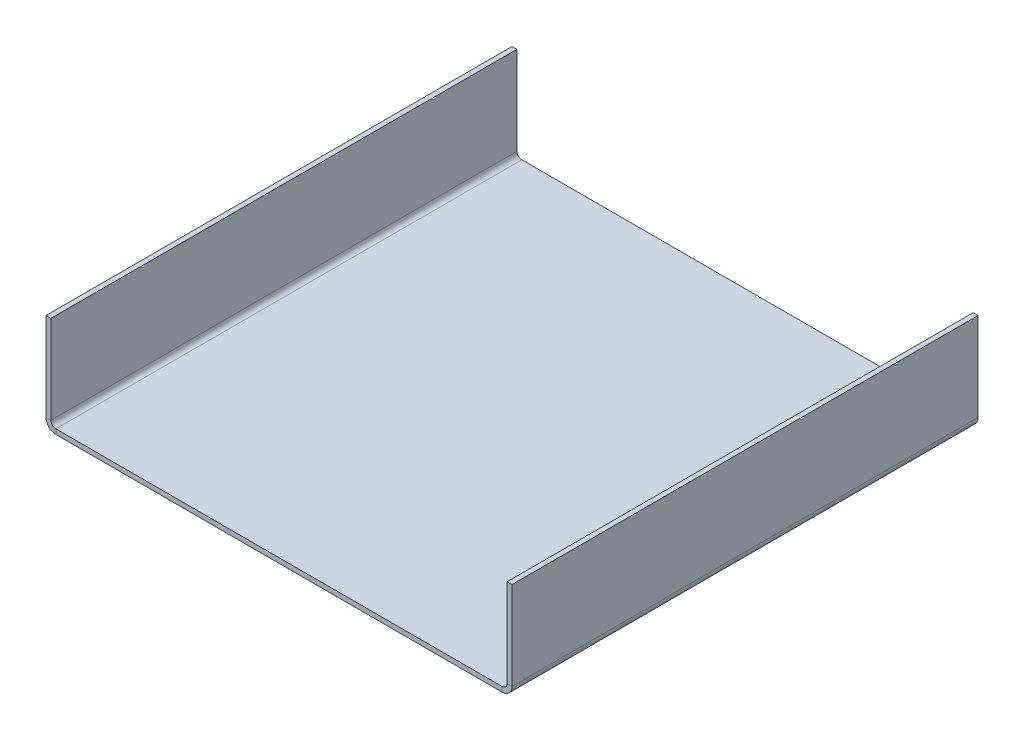
ISO-10303-21;
HEADER;
FILE_DESCRIPTION(('STEP AP214'),'2;1');
FILE_NAME('part.step','',(''),(''),'','','');
FILE_SCHEMA(('AUTOMOTIVE_DESIGN { 1 0 10303 214 1 1 1 1 }'));
ENDSEC;
DATA;
#1=APPLICATION_CONTEXT('core data for automotive mechanical design processes');
#2=APPLICATION_PROTOCOL_DEFINITION('international standard','automotive_design',2000,#1);
#3=PRODUCT_CONTEXT('',#1,'mechanical');
#4=PRODUCT('Part','Part','',(#3));
#5=PRODUCT_RELATED_PRODUCT_CATEGORY('part','',(#4));
#6=PRODUCT_DEFINITION_FORMATION('','',#4);
#7=PRODUCT_DEFINITION_CONTEXT('part definition',#1,'design');
#8=PRODUCT_DEFINITION('design','',#6,#7);
#9=PRODUCT_DEFINITION_SHAPE('','',#8);
#10=(LENGTH_UNIT() NAMED_UNIT(*) SI_UNIT(.MILLI.,.METRE.));
#11=(NAMED_UNIT(*) PLANE_ANGLE_UNIT() SI_UNIT($,.RADIAN.));
#12=(NAMED_UNIT(*) SI_UNIT($,.STERADIAN.) SOLID_ANGLE_UNIT());
#13=UNCERTAINTY_MEASURE_WITH_UNIT(LENGTH_MEASURE(1.E-05),#10,'distance_accuracy_value','');
#14=(GEOMETRIC_REPRESENTATION_CONTEXT(3) GLOBAL_UNCERTAINTY_ASSIGNED_CONTEXT((#13)) GLOBAL_UNIT_ASSIGNED_CONTEXT((#10,
#11,#12)) REPRESENTATION_CONTEXT('',''));
#15=CARTESIAN_POINT('',(0.,0.,0.));
#16=DIRECTION('',(0.,0.,1.));
#17=DIRECTION('',(1.,0.,0.));
#18=AXIS2_PLACEMENT_3D('',#15,#16,#17);
#19=CARTESIAN_POINT('',(0.,0.,0.));
#20=DIRECTION('',(0.,-1.,0.));
#21=DIRECTION('',(0.,0.,-1.));
#22=AXIS2_PLACEMENT_3D('',#19,#20,#21);
#23=PLANE('',#22);
#24=DIRECTION('',(-1.,0.,0.));
#25=VECTOR('',#24,1.);
#26=CARTESIAN_POINT('',(-47.5,0.,-47.5));
#27=LINE('',#26,#25);
#28=CARTESIAN_POINT('',(45.5,0.,-47.5));
#29=VERTEX_POINT('',#28);
#30=CARTESIAN_POINT('',(-45.5,0.,-47.5));
#31=VERTEX_POINT('',#30);
#32=EDGE_CURVE('E13',#29,#31,#27,.T.);
#33=ORIENTED_EDGE('',*,*,#32,.F.);
#34=DIRECTION('',(0.,0.,-1.));
#35=VECTOR('',#34,1.);
#36=CARTESIAN_POINT('',(45.5,0.,-47.5));
#37=LINE('',#36,#35);
#38=CARTESIAN_POINT('',(45.5,0.,47.5));
#39=VERTEX_POINT('',#38);
#40=EDGE_CURVE('E218',#29,#39,#37,.F.);
#41=ORIENTED_EDGE('',*,*,#40,.T.);
#42=DIRECTION('',(1.,0.,0.));
#43=VECTOR('',#42,1.);
#44=CARTESIAN_POINT('',(-47.5,0.,47.5));
#45=LINE('',#44,#43);
#46=CARTESIAN_POINT('',(-45.5,0.,47.5));
#47=VERTEX_POINT('',#46);
#48=EDGE_CURVE('E92',#47,#39,#45,.T.);
#49=ORIENTED_EDGE('',*,*,#48,.F.);
#50=DIRECTION('',(0.,0.,1.));
#51=VECTOR('',#50,1.);
#52=CARTESIAN_POINT('',(-45.5,0.,47.5));
#53=LINE('',#52,#51);
#54=EDGE_CURVE('E270',#47,#31,#53,.F.);
#55=ORIENTED_EDGE('',*,*,#54,.T.);
#56=EDGE_LOOP('',(#33,#41,#49,#55));
#57=FACE_BOUND('',#56,.T.);
#58=ADVANCED_FACE('F83',(#57),#23,.T.);
#59=CARTESIAN_POINT('',(0.,1.,0.));
#60=DIRECTION('',(0.,-1.,0.));
#61=DIRECTION('',(0.,0.,-1.));
#62=AXIS2_PLACEMENT_3D('',#59,#60,#61);
#63=PLANE('',#62);
#64=DIRECTION('',(0.,0.,-1.));
#65=VECTOR('',#64,1.);
#66=CARTESIAN_POINT('',(45.5,0.999999999999997,-47.5));
#67=LINE('',#66,#65);
#68=CARTESIAN_POINT('',(45.5,0.999999999999997,-47.5));
#69=VERTEX_POINT('',#68);
#70=CARTESIAN_POINT('',(45.5,0.999999999999997,47.5));
#71=VERTEX_POINT('',#70);
#72=EDGE_CURVE('E229',#69,#71,#67,.F.);
#73=ORIENTED_EDGE('',*,*,#72,.F.);
#74=DIRECTION('',(1.,0.,0.));
#75=VECTOR('',#74,1.);
#76=CARTESIAN_POINT('',(0.,1.,-47.5));
#77=LINE('',#76,#75);
#78=CARTESIAN_POINT('',(-45.5,0.999999999999997,-47.5));
#79=VERTEX_POINT('',#78);
#80=EDGE_CURVE('E290',#69,#79,#77,.F.);
#81=ORIENTED_EDGE('',*,*,#80,.T.);
#82=DIRECTION('',(0.,0.,1.));
#83=VECTOR('',#82,1.);
#84=CARTESIAN_POINT('',(-45.5,0.999999999999997,47.5));
#85=LINE('',#84,#83);
#86=CARTESIAN_POINT('',(-45.5,0.999999999999997,47.5));
#87=VERTEX_POINT('',#86);
#88=EDGE_CURVE('E281',#87,#79,#85,.F.);
#89=ORIENTED_EDGE('',*,*,#88,.F.);
#90=DIRECTION('',(1.,0.,0.));
#91=VECTOR('',#90,1.);
#92=CARTESIAN_POINT('',(0.,1.,47.5));
#93=LINE('',#92,#91);
#94=EDGE_CURVE('E87',#87,#71,#93,.T.);
#95=ORIENTED_EDGE('',*,*,#94,.T.);
#96=EDGE_LOOP('',(#73,#81,#89,#95));
#97=FACE_BOUND('',#96,.T.);
#98=ADVANCED_FACE('F299',(#97),#63,.F.);
#99=CARTESIAN_POINT('',(-47.5,0.,-47.5));
#100=DIRECTION('',(0.,0.,1.));
#101=DIRECTION('',(-1.,0.,0.));
#102=AXIS2_PLACEMENT_3D('',#99,#100,#101);
#103=PLANE('',#102);
#104=ORIENTED_EDGE('',*,*,#80,.F.);
#105=DIRECTION('',(0.,-1.,0.));
#106=VECTOR('',#105,1.);
#107=CARTESIAN_POINT('',(45.5,0.999999999999997,-47.5));
#108=LINE('',#107,#106);
#109=EDGE_CURVE('E223',#69,#29,#108,.T.);
#110=ORIENTED_EDGE('',*,*,#109,.T.);
#111=ORIENTED_EDGE('',*,*,#32,.T.);
#112=DIRECTION('',(0.,-1.,0.));
#113=VECTOR('',#112,1.);
#114=CARTESIAN_POINT('',(-45.5,0.999999999999997,-47.5));
#115=LINE('',#114,#113);
#116=EDGE_CURVE('E285',#79,#31,#115,.T.);
#117=ORIENTED_EDGE('',*,*,#116,.F.);
#118=EDGE_LOOP('',(#104,#110,#111,#117));
#119=FACE_BOUND('',#118,.T.);
#120=ADVANCED_FACE('F313',(#119),#103,.F.);
#121=CARTESIAN_POINT('',(-47.5,0.,47.5));
#122=DIRECTION('',(0.,0.,-1.));
#123=DIRECTION('',(1.,0.,0.));
#124=AXIS2_PLACEMENT_3D('',#121,#122,#123);
#125=PLANE('',#124);
#126=DIRECTION('',(0.,-1.,0.));
#127=VECTOR('',#126,1.);
#128=CARTESIAN_POINT('',(45.5,0.999999999999997,47.5));
#129=LINE('',#128,#127);
#130=EDGE_CURVE('E233',#71,#39,#129,.T.);
#131=ORIENTED_EDGE('',*,*,#130,.F.);
#132=ORIENTED_EDGE('',*,*,#94,.F.);
#133=DIRECTION('',(0.,-1.,0.));
#134=VECTOR('',#133,1.);
#135=CARTESIAN_POINT('',(-45.5,0.999999999999997,47.5));
#136=LINE('',#135,#134);
#137=EDGE_CURVE('E275',#87,#47,#136,.T.);
#138=ORIENTED_EDGE('',*,*,#137,.T.);
#139=ORIENTED_EDGE('',*,*,#48,.T.);
#140=EDGE_LOOP('',(#131,#132,#138,#139));
#141=FACE_BOUND('',#140,.T.);
#142=ADVANCED_FACE('F85',(#141),#125,.F.);
#143=CARTESIAN_POINT('',(-45.5,2.,-47.5));
#144=DIRECTION('',(0.,0.,-1.));
#145=DIRECTION('',(-1.,0.,0.));
#146=AXIS2_PLACEMENT_3D('',#143,#144,#145);
#147=PLANE('',#146);
#148=DIRECTION('',(-1.,0.,0.));
#149=VECTOR('',#148,1.);
#150=CARTESIAN_POINT('',(-47.5,1.99999999999999,-47.5));
#151=LINE('',#150,#149);
#152=CARTESIAN_POINT('',(-46.5,1.99999999999999,-47.5));
#153=VERTEX_POINT('',#152);
#154=CARTESIAN_POINT('',(-47.5,1.99999999999999,-47.5));
#155=VERTEX_POINT('',#154);
#156=EDGE_CURVE('E235',#153,#155,#151,.T.);
#157=ORIENTED_EDGE('',*,*,#156,.F.);
#158=CARTESIAN_POINT('',(-45.5,2.,-47.5));
#159=DIRECTION('',(0.,0.,1.));
#160=DIRECTION('',(1.,0.,0.));
#161=AXIS2_PLACEMENT_3D('',#158,#159,#160);
#162=CIRCLE('',#161,1.);
#163=EDGE_CURVE('E278',#79,#153,#162,.F.);
#164=ORIENTED_EDGE('',*,*,#163,.F.);
#165=ORIENTED_EDGE('',*,*,#116,.T.);
#166=CARTESIAN_POINT('',(-45.5,2.,-47.5));
#167=DIRECTION('',(0.,0.,1.));
#168=DIRECTION('',(1.,0.,0.));
#169=AXIS2_PLACEMENT_3D('',#166,#167,#168);
#170=CIRCLE('',#169,2.);
#171=EDGE_CURVE('E100',#31,#155,#170,.F.);
#172=ORIENTED_EDGE('',*,*,#171,.T.);
#173=EDGE_LOOP('',(#157,#164,#165,#172));
#174=FACE_BOUND('',#173,.T.);
#175=ADVANCED_FACE('F316',(#174),#147,.T.);
#176=CARTESIAN_POINT('',(-45.5,2.,47.5));
#177=DIRECTION('',(0.,0.,-1.));
#178=DIRECTION('',(-1.,0.,0.));
#179=AXIS2_PLACEMENT_3D('',#176,#177,#178);
#180=PLANE('',#179);
#181=CARTESIAN_POINT('',(-45.5,2.,47.5));
#182=DIRECTION('',(0.,0.,1.));
#183=DIRECTION('',(1.,0.,0.));
#184=AXIS2_PLACEMENT_3D('',#181,#182,#183);
#185=CIRCLE('',#184,1.);
#186=CARTESIAN_POINT('',(-46.5,1.99999999999999,47.5));
#187=VERTEX_POINT('',#186);
#188=EDGE_CURVE('E240',#187,#87,#185,.T.);
#189=ORIENTED_EDGE('',*,*,#188,.F.);
#190=DIRECTION('',(-1.,0.,0.));
#191=VECTOR('',#190,1.);
#192=CARTESIAN_POINT('',(-46.5,1.99999999999999,47.5));
#193=LINE('',#192,#191);
#194=CARTESIAN_POINT('',(-47.5,1.99999999999999,47.5));
#195=VERTEX_POINT('',#194);
#196=EDGE_CURVE('E263',#187,#195,#193,.T.);
#197=ORIENTED_EDGE('',*,*,#196,.T.);
#198=CARTESIAN_POINT('',(-45.5,2.,47.5));
#199=DIRECTION('',(0.,0.,1.));
#200=DIRECTION('',(1.,0.,0.));
#201=AXIS2_PLACEMENT_3D('',#198,#199,#200);
#202=CIRCLE('',#201,2.);
#203=EDGE_CURVE('E273',#195,#47,#202,.T.);
#204=ORIENTED_EDGE('',*,*,#203,.T.);
#205=ORIENTED_EDGE('',*,*,#137,.F.);
#206=EDGE_LOOP('',(#189,#197,#204,#205));
#207=FACE_BOUND('',#206,.T.);
#208=ADVANCED_FACE('F338',(#207),#180,.F.);
#209=CARTESIAN_POINT('',(-45.5,2.,47.5));
#210=DIRECTION('',(0.,0.,1.));
#211=DIRECTION('',(-1.,0.,0.));
#212=AXIS2_PLACEMENT_3D('',#209,#210,#211);
#213=CYLINDRICAL_SURFACE('',#212,2.);
#214=ORIENTED_EDGE('',*,*,#54,.F.);
#215=ORIENTED_EDGE('',*,*,#203,.F.);
#216=DIRECTION('',(0.,0.,1.));
#217=VECTOR('',#216,1.);
#218=CARTESIAN_POINT('',(-47.5,1.99999999999999,0.));
#219=LINE('',#218,#217);
#220=EDGE_CURVE('E260',#155,#195,#219,.T.);
#221=ORIENTED_EDGE('',*,*,#220,.F.);
#222=ORIENTED_EDGE('',*,*,#171,.F.);
#223=EDGE_LOOP('',(#214,#215,#221,#222));
#224=FACE_BOUND('',#223,.T.);
#225=ADVANCED_FACE('F341',(#224),#213,.T.);
#226=CARTESIAN_POINT('',(-45.5,2.,47.5));
#227=DIRECTION('',(0.,0.,1.));
#228=DIRECTION('',(-1.,0.,0.));
#229=AXIS2_PLACEMENT_3D('',#226,#227,#228);
#230=CYLINDRICAL_SURFACE('',#229,1.);
#231=ORIENTED_EDGE('',*,*,#88,.T.);
#232=ORIENTED_EDGE('',*,*,#163,.T.);
#233=DIRECTION('',(0.,0.,-1.));
#234=VECTOR('',#233,1.);
#235=CARTESIAN_POINT('',(-46.5,1.99999999999999,-47.5));
#236=LINE('',#235,#234);
#237=EDGE_CURVE('E266',#153,#187,#236,.F.);
#238=ORIENTED_EDGE('',*,*,#237,.T.);
#239=ORIENTED_EDGE('',*,*,#188,.T.);
#240=EDGE_LOOP('',(#231,#232,#238,#239));
#241=FACE_BOUND('',#240,.T.);
#242=ADVANCED_FACE('F319',(#241),#230,.F.);
#243=CARTESIAN_POINT('',(-47.5,0.999999999999997,47.5));
#244=DIRECTION('',(0.,0.,1.));
#245=DIRECTION('',(1.,0.,0.));
#246=AXIS2_PLACEMENT_3D('',#243,#244,#245);
#247=PLANE('',#246);
#248=DIRECTION('',(0.,-1.,0.));
#249=VECTOR('',#248,1.);
#250=CARTESIAN_POINT('',(-47.5,0.999999999999997,47.5));
#251=LINE('',#250,#249);
#252=CARTESIAN_POINT('',(-47.5000000000001,20.,47.5));
#253=VERTEX_POINT('',#252);
#254=EDGE_CURVE('E244',#253,#195,#251,.T.);
#255=ORIENTED_EDGE('',*,*,#254,.T.);
#256=ORIENTED_EDGE('',*,*,#196,.F.);
#257=DIRECTION('',(0.,1.,0.));
#258=VECTOR('',#257,1.);
#259=CARTESIAN_POINT('',(-46.5,-1.73472347597681E-13,47.5));
#260=LINE('',#259,#258);
#261=CARTESIAN_POINT('',(-46.5000000000001,20.,47.5));
#262=VERTEX_POINT('',#261);
#263=EDGE_CURVE('E252',#262,#187,#260,.F.);
#264=ORIENTED_EDGE('',*,*,#263,.F.);
#265=DIRECTION('',(1.,0.,0.));
#266=VECTOR('',#265,1.);
#267=CARTESIAN_POINT('',(-47.5000000000001,20.,47.5));
#268=LINE('',#267,#266);
#269=EDGE_CURVE('E238',#253,#262,#268,.T.);
#270=ORIENTED_EDGE('',*,*,#269,.F.);
#271=EDGE_LOOP('',(#255,#256,#264,#270));
#272=FACE_BOUND('',#271,.T.);
#273=ADVANCED_FACE('F335',(#272),#247,.T.);
#274=CARTESIAN_POINT('',(-47.5000000000001,20.,-47.5));
#275=DIRECTION('',(0.,0.,-1.));
#276=DIRECTION('',(-1.,0.,0.));
#277=AXIS2_PLACEMENT_3D('',#274,#275,#276);
#278=PLANE('',#277);
#279=DIRECTION('',(0.,-1.,0.));
#280=VECTOR('',#279,1.);
#281=CARTESIAN_POINT('',(-46.5,-1.73472347597681E-13,-47.5));
#282=LINE('',#281,#280);
#283=CARTESIAN_POINT('',(-46.5000000000001,20.,-47.5));
#284=VERTEX_POINT('',#283);
#285=EDGE_CURVE('E258',#153,#284,#282,.F.);
#286=ORIENTED_EDGE('',*,*,#285,.F.);
#287=ORIENTED_EDGE('',*,*,#156,.T.);
#288=DIRECTION('',(0.,1.,0.));
#289=VECTOR('',#288,1.);
#290=CARTESIAN_POINT('',(-47.5000000000001,20.,-47.5));
#291=LINE('',#290,#289);
#292=CARTESIAN_POINT('',(-47.5000000000001,20.,-47.5));
#293=VERTEX_POINT('',#292);
#294=EDGE_CURVE('E250',#155,#293,#291,.T.);
#295=ORIENTED_EDGE('',*,*,#294,.T.);
#296=DIRECTION('',(1.,0.,0.));
#297=VECTOR('',#296,1.);
#298=CARTESIAN_POINT('',(-47.5000000000001,20.,-47.5));
#299=LINE('',#298,#297);
#300=EDGE_CURVE('E241',#293,#284,#299,.T.);
#301=ORIENTED_EDGE('',*,*,#300,.T.);
#302=EDGE_LOOP('',(#286,#287,#295,#301));
#303=FACE_BOUND('',#302,.T.);
#304=ADVANCED_FACE('F327',(#303),#278,.T.);
#305=CARTESIAN_POINT('',(-47.5,-1.76963828936524E-13,0.));
#306=DIRECTION('',(-1.,0.,0.));
#307=DIRECTION('',(0.,-1.,0.));
#308=AXIS2_PLACEMENT_3D('',#305,#306,#307);
#309=PLANE('',#308);
#310=ORIENTED_EDGE('',*,*,#294,.F.);
#311=ORIENTED_EDGE('',*,*,#220,.T.);
#312=ORIENTED_EDGE('',*,*,#254,.F.);
#313=DIRECTION('',(0.,0.,1.));
#314=VECTOR('',#313,1.);
#315=CARTESIAN_POINT('',(-47.5000000000001,20.,47.5));
#316=LINE('',#315,#314);
#317=EDGE_CURVE('E247',#293,#253,#316,.T.);
#318=ORIENTED_EDGE('',*,*,#317,.F.);
#319=EDGE_LOOP('',(#310,#311,#312,#318));
#320=FACE_BOUND('',#319,.T.);
#321=ADVANCED_FACE('F340',(#320),#309,.T.);
#322=CARTESIAN_POINT('',(-46.5,-1.73472347597681E-13,0.));
#323=DIRECTION('',(-1.,0.,0.));
#324=DIRECTION('',(0.,-1.,0.));
#325=AXIS2_PLACEMENT_3D('',#322,#323,#324);
#326=PLANE('',#325);
#327=ORIENTED_EDGE('',*,*,#237,.F.);
#328=ORIENTED_EDGE('',*,*,#285,.T.);
#329=DIRECTION('',(0.,0.,-1.));
#330=VECTOR('',#329,1.);
#331=CARTESIAN_POINT('',(-46.5000000000001,20.,0.));
#332=LINE('',#331,#330);
#333=EDGE_CURVE('E255',#284,#262,#332,.F.);
#334=ORIENTED_EDGE('',*,*,#333,.T.);
#335=ORIENTED_EDGE('',*,*,#263,.T.);
#336=EDGE_LOOP('',(#327,#328,#334,#335));
#337=FACE_BOUND('',#336,.T.);
#338=ADVANCED_FACE('F323',(#337),#326,.F.);
#339=CARTESIAN_POINT('',(-47.5000000000001,20.,47.5));
#340=DIRECTION('',(0.,1.,0.));
#341=DIRECTION('',(-1.,0.,0.));
#342=AXIS2_PLACEMENT_3D('',#339,#340,#341);
#343=PLANE('',#342);
#344=ORIENTED_EDGE('',*,*,#333,.F.);
#345=ORIENTED_EDGE('',*,*,#300,.F.);
#346=ORIENTED_EDGE('',*,*,#317,.T.);
#347=ORIENTED_EDGE('',*,*,#269,.T.);
#348=EDGE_LOOP('',(#344,#345,#346,#347));
#349=FACE_BOUND('',#348,.T.);
#350=ADVANCED_FACE('F333',(#349),#343,.T.);
#351=CARTESIAN_POINT('',(45.5,2.,47.5));
#352=DIRECTION('',(0.,0.,1.));
#353=DIRECTION('',(1.,0.,0.));
#354=AXIS2_PLACEMENT_3D('',#351,#352,#353);
#355=PLANE('',#354);
#356=DIRECTION('',(1.,0.,0.));
#357=VECTOR('',#356,1.);
#358=CARTESIAN_POINT('',(47.5,1.99999999999999,47.5));
#359=LINE('',#358,#357);
#360=CARTESIAN_POINT('',(46.5,1.99999999999999,47.5));
#361=VERTEX_POINT('',#360);
#362=CARTESIAN_POINT('',(47.5,1.99999999999999,47.5));
#363=VERTEX_POINT('',#362);
#364=EDGE_CURVE('E215',#361,#363,#359,.T.);
#365=ORIENTED_EDGE('',*,*,#364,.F.);
#366=CARTESIAN_POINT('',(45.5,2.,47.5));
#367=DIRECTION('',(0.,0.,-1.));
#368=DIRECTION('',(-1.,0.,0.));
#369=AXIS2_PLACEMENT_3D('',#366,#367,#368);
#370=CIRCLE('',#369,1.);
#371=EDGE_CURVE('E226',#71,#361,#370,.F.);
#372=ORIENTED_EDGE('',*,*,#371,.F.);
#373=ORIENTED_EDGE('',*,*,#130,.T.);
#374=CARTESIAN_POINT('',(45.5,2.,47.5));
#375=DIRECTION('',(0.,0.,-1.));
#376=DIRECTION('',(-1.,0.,0.));
#377=AXIS2_PLACEMENT_3D('',#374,#375,#376);
#378=CIRCLE('',#377,2.);
#379=EDGE_CURVE('E108',#39,#363,#378,.F.);
#380=ORIENTED_EDGE('',*,*,#379,.T.);
#381=EDGE_LOOP('',(#365,#372,#373,#380));
#382=FACE_BOUND('',#381,.T.);
#383=ADVANCED_FACE('F305',(#382),#355,.T.);
#384=CARTESIAN_POINT('',(45.5,2.,-47.5));
#385=DIRECTION('',(0.,0.,1.));
#386=DIRECTION('',(1.,0.,0.));
#387=AXIS2_PLACEMENT_3D('',#384,#385,#386);
#388=PLANE('',#387);
#389=CARTESIAN_POINT('',(45.5,2.,-47.5));
#390=DIRECTION('',(0.,0.,-1.));
#391=DIRECTION('',(-1.,0.,0.));
#392=AXIS2_PLACEMENT_3D('',#389,#390,#391);
#393=CIRCLE('',#392,1.);
#394=CARTESIAN_POINT('',(46.5,1.99999999999999,-47.5));
#395=VERTEX_POINT('',#394);
#396=EDGE_CURVE('E185',#395,#69,#393,.T.);
#397=ORIENTED_EDGE('',*,*,#396,.F.);
#398=DIRECTION('',(1.,0.,0.));
#399=VECTOR('',#398,1.);
#400=CARTESIAN_POINT('',(46.5,1.99999999999999,-47.5));
#401=LINE('',#400,#399);
#402=CARTESIAN_POINT('',(47.5,1.99999999999999,-47.5));
#403=VERTEX_POINT('',#402);
#404=EDGE_CURVE('E210',#395,#403,#401,.T.);
#405=ORIENTED_EDGE('',*,*,#404,.T.);
#406=CARTESIAN_POINT('',(45.5,2.,-47.5));
#407=DIRECTION('',(0.,0.,-1.));
#408=DIRECTION('',(-1.,0.,0.));
#409=AXIS2_PLACEMENT_3D('',#406,#407,#408);
#410=CIRCLE('',#409,2.);
#411=EDGE_CURVE('E221',#403,#29,#410,.T.);
#412=ORIENTED_EDGE('',*,*,#411,.T.);
#413=ORIENTED_EDGE('',*,*,#109,.F.);
#414=EDGE_LOOP('',(#397,#405,#412,#413));
#415=FACE_BOUND('',#414,.T.);
#416=ADVANCED_FACE('F311',(#415),#388,.F.);
#417=CARTESIAN_POINT('',(45.5,2.,-47.5));
#418=DIRECTION('',(0.,0.,-1.));
#419=DIRECTION('',(1.,0.,0.));
#420=AXIS2_PLACEMENT_3D('',#417,#418,#419);
#421=CYLINDRICAL_SURFACE('',#420,2.);
#422=ORIENTED_EDGE('',*,*,#40,.F.);
#423=ORIENTED_EDGE('',*,*,#411,.F.);
#424=DIRECTION('',(0.,0.,-1.));
#425=VECTOR('',#424,1.);
#426=CARTESIAN_POINT('',(47.5,1.99999999999999,47.5));
#427=LINE('',#426,#425);
#428=EDGE_CURVE('E194',#403,#363,#427,.F.);
#429=ORIENTED_EDGE('',*,*,#428,.T.);
#430=ORIENTED_EDGE('',*,*,#379,.F.);
#431=EDGE_LOOP('',(#422,#423,#429,#430));
#432=FACE_BOUND('',#431,.T.);
#433=ADVANCED_FACE('F308',(#432),#421,.T.);
#434=CARTESIAN_POINT('',(45.5,2.,-47.5));
#435=DIRECTION('',(0.,0.,-1.));
#436=DIRECTION('',(1.,0.,0.));
#437=AXIS2_PLACEMENT_3D('',#434,#435,#436);
#438=CYLINDRICAL_SURFACE('',#437,1.);
#439=ORIENTED_EDGE('',*,*,#72,.T.);
#440=ORIENTED_EDGE('',*,*,#371,.T.);
#441=DIRECTION('',(0.,0.,-1.));
#442=VECTOR('',#441,1.);
#443=CARTESIAN_POINT('',(46.5,1.99999999999999,47.5));
#444=LINE('',#443,#442);
#445=EDGE_CURVE('E213',#361,#395,#444,.T.);
#446=ORIENTED_EDGE('',*,*,#445,.T.);
#447=ORIENTED_EDGE('',*,*,#396,.T.);
#448=EDGE_LOOP('',(#439,#440,#446,#447));
#449=FACE_BOUND('',#448,.T.);
#450=ADVANCED_FACE('F457',(#449),#438,.F.);
#451=CARTESIAN_POINT('',(47.5,0.999999999999997,47.5));
#452=DIRECTION('',(0.,0.,1.));
#453=DIRECTION('',(1.,0.,0.));
#454=AXIS2_PLACEMENT_3D('',#451,#452,#453);
#455=PLANE('',#454);
#456=DIRECTION('',(0.,1.,0.));
#457=VECTOR('',#456,1.);
#458=CARTESIAN_POINT('',(46.5,-1.73472347597681E-13,47.5));
#459=LINE('',#458,#457);
#460=CARTESIAN_POINT('',(46.5000000000001,20.,47.5));
#461=VERTEX_POINT('',#460);
#462=EDGE_CURVE('E207',#361,#461,#459,.T.);
#463=ORIENTED_EDGE('',*,*,#462,.F.);
#464=ORIENTED_EDGE('',*,*,#364,.T.);
#465=DIRECTION('',(0.,-1.,0.));
#466=VECTOR('',#465,1.);
#467=CARTESIAN_POINT('',(47.5,0.999999999999997,47.5));
#468=LINE('',#467,#466);
#469=CARTESIAN_POINT('',(47.5000000000001,20.,47.5));
#470=VERTEX_POINT('',#469);
#471=EDGE_CURVE('E199',#363,#470,#468,.F.);
#472=ORIENTED_EDGE('',*,*,#471,.T.);
#473=DIRECTION('',(-1.,0.,0.));
#474=VECTOR('',#473,1.);
#475=CARTESIAN_POINT('',(47.5000000000001,20.,47.5));
#476=LINE('',#475,#474);
#477=EDGE_CURVE('E186',#470,#461,#476,.T.);
#478=ORIENTED_EDGE('',*,*,#477,.T.);
#479=EDGE_LOOP('',(#463,#464,#472,#478));
#480=FACE_BOUND('',#479,.T.);
#481=ADVANCED_FACE('F467',(#480),#455,.T.);
#482=CARTESIAN_POINT('',(47.5000000000001,20.,-47.5));
#483=DIRECTION('',(0.,0.,-1.));
#484=DIRECTION('',(-1.,0.,0.));
#485=AXIS2_PLACEMENT_3D('',#482,#483,#484);
#486=PLANE('',#485);
#487=DIRECTION('',(0.,1.,0.));
#488=VECTOR('',#487,1.);
#489=CARTESIAN_POINT('',(47.5000000000001,20.,-47.5));
#490=LINE('',#489,#488);
#491=CARTESIAN_POINT('',(47.5000000000001,20.,-47.5));
#492=VERTEX_POINT('',#491);
#493=EDGE_CURVE('E178',#492,#403,#490,.F.);
#494=ORIENTED_EDGE('',*,*,#493,.T.);
#495=ORIENTED_EDGE('',*,*,#404,.F.);
#496=DIRECTION('',(0.,-1.,0.));
#497=VECTOR('',#496,1.);
#498=CARTESIAN_POINT('',(46.5,-1.73472347597681E-13,-47.5));
#499=LINE('',#498,#497);
#500=CARTESIAN_POINT('',(46.5000000000001,20.,-47.5));
#501=VERTEX_POINT('',#500);
#502=EDGE_CURVE('E180',#501,#395,#499,.T.);
#503=ORIENTED_EDGE('',*,*,#502,.F.);
#504=DIRECTION('',(-1.,0.,0.));
#505=VECTOR('',#504,1.);
#506=CARTESIAN_POINT('',(47.5000000000001,20.,-47.5));
#507=LINE('',#506,#505);
#508=EDGE_CURVE('E174',#492,#501,#507,.T.);
#509=ORIENTED_EDGE('',*,*,#508,.F.);
#510=EDGE_LOOP('',(#494,#495,#503,#509));
#511=FACE_BOUND('',#510,.T.);
#512=ADVANCED_FACE('F176',(#511),#486,.T.);
#513=CARTESIAN_POINT('',(47.5,-1.76963828936524E-13,0.));
#514=DIRECTION('',(-1.,0.,0.));
#515=DIRECTION('',(0.,-1.,0.));
#516=AXIS2_PLACEMENT_3D('',#513,#514,#515);
#517=PLANE('',#516);
#518=ORIENTED_EDGE('',*,*,#428,.F.);
#519=ORIENTED_EDGE('',*,*,#493,.F.);
#520=DIRECTION('',(0.,0.,1.));
#521=VECTOR('',#520,1.);
#522=CARTESIAN_POINT('',(47.5000000000001,20.,47.5));
#523=LINE('',#522,#521);
#524=EDGE_CURVE('E193',#470,#492,#523,.F.);
#525=ORIENTED_EDGE('',*,*,#524,.F.);
#526=ORIENTED_EDGE('',*,*,#471,.F.);
#527=EDGE_LOOP('',(#518,#519,#525,#526));
#528=FACE_BOUND('',#527,.T.);
#529=ADVANCED_FACE('F191',(#528),#517,.F.);
#530=CARTESIAN_POINT('',(46.5,-1.73472347597681E-13,0.));
#531=DIRECTION('',(-1.,0.,0.));
#532=DIRECTION('',(0.,-1.,0.));
#533=AXIS2_PLACEMENT_3D('',#530,#531,#532);
#534=PLANE('',#533);
#535=ORIENTED_EDGE('',*,*,#502,.T.);
#536=ORIENTED_EDGE('',*,*,#445,.F.);
#537=ORIENTED_EDGE('',*,*,#462,.T.);
#538=DIRECTION('',(0.,0.,-1.));
#539=VECTOR('',#538,1.);
#540=CARTESIAN_POINT('',(46.5000000000001,20.,0.));
#541=LINE('',#540,#539);
#542=EDGE_CURVE('E205',#461,#501,#541,.T.);
#543=ORIENTED_EDGE('',*,*,#542,.T.);
#544=EDGE_LOOP('',(#535,#536,#537,#543));
#545=FACE_BOUND('',#544,.T.);
#546=ADVANCED_FACE('F497',(#545),#534,.T.);
#547=CARTESIAN_POINT('',(47.5000000000001,20.,47.5));
#548=DIRECTION('',(0.,1.,0.));
#549=DIRECTION('',(-1.,0.,0.));
#550=AXIS2_PLACEMENT_3D('',#547,#548,#549);
#551=PLANE('',#550);
#552=ORIENTED_EDGE('',*,*,#542,.F.);
#553=ORIENTED_EDGE('',*,*,#477,.F.);
#554=ORIENTED_EDGE('',*,*,#524,.T.);
#555=ORIENTED_EDGE('',*,*,#508,.T.);
#556=EDGE_LOOP('',(#552,#553,#554,#555));
#557=FACE_BOUND('',#556,.T.);
#558=ADVANCED_FACE('F197',(#557),#551,.T.);
#559=CLOSED_SHELL('',(#58,#98,#120,#142,#175,#208,#225,#242,#273,#304,#321,#338,#350,#383,#416,
#433,#450,#481,#512,#529,#546,#558));
#560=MANIFOLD_SOLID_BREP('B2',#559);
#561=ADVANCED_BREP_SHAPE_REPRESENTATION('',(#18,#560),#14);
#562=SHAPE_DEFINITION_REPRESENTATION(#9,#561);
ENDSEC;
END-ISO-10303-21;
